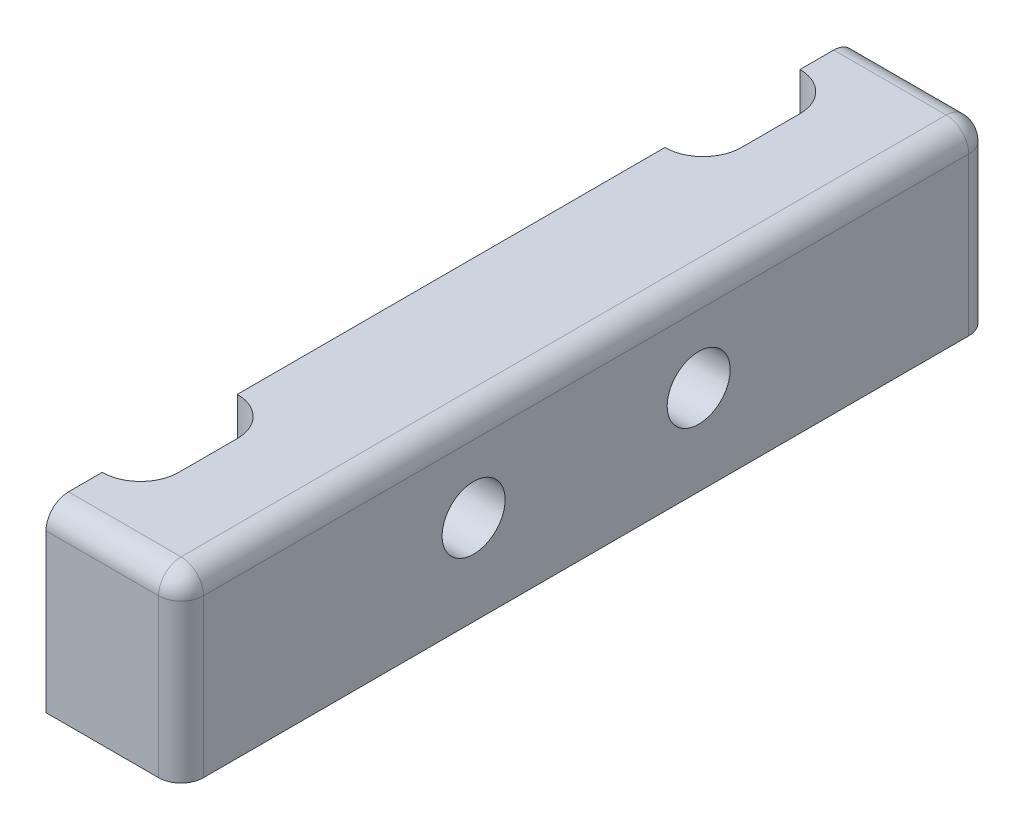
ISO-10303-21;
HEADER;
FILE_DESCRIPTION(('STEP AP214'),'2;1');
FILE_NAME('part.step','',(''),(''),'','','');
FILE_SCHEMA(('AUTOMOTIVE_DESIGN { 1 0 10303 214 1 1 1 1 }'));
ENDSEC;
DATA;
#1=APPLICATION_CONTEXT('core data for automotive mechanical design processes');
#2=APPLICATION_PROTOCOL_DEFINITION('international standard','automotive_design',2000,#1);
#3=PRODUCT_CONTEXT('',#1,'mechanical');
#4=PRODUCT('Part','Part','',(#3));
#5=PRODUCT_RELATED_PRODUCT_CATEGORY('part','',(#4));
#6=PRODUCT_DEFINITION_FORMATION('','',#4);
#7=PRODUCT_DEFINITION_CONTEXT('part definition',#1,'design');
#8=PRODUCT_DEFINITION('design','',#6,#7);
#9=PRODUCT_DEFINITION_SHAPE('','',#8);
#10=(LENGTH_UNIT() NAMED_UNIT(*) SI_UNIT(.MILLI.,.METRE.));
#11=(NAMED_UNIT(*) PLANE_ANGLE_UNIT() SI_UNIT($,.RADIAN.));
#12=(NAMED_UNIT(*) SI_UNIT($,.STERADIAN.) SOLID_ANGLE_UNIT());
#13=UNCERTAINTY_MEASURE_WITH_UNIT(LENGTH_MEASURE(1.E-05),#10,'distance_accuracy_value','');
#14=(GEOMETRIC_REPRESENTATION_CONTEXT(3) GLOBAL_UNCERTAINTY_ASSIGNED_CONTEXT((#13)) GLOBAL_UNIT_ASSIGNED_CONTEXT((#10,
#11,#12)) REPRESENTATION_CONTEXT('',''));
#15=CARTESIAN_POINT('',(0.,0.,0.));
#16=DIRECTION('',(0.,0.,1.));
#17=DIRECTION('',(1.,0.,0.));
#18=AXIS2_PLACEMENT_3D('',#15,#16,#17);
#19=CARTESIAN_POINT('',(-5.99999999999999,8.,-18.));
#20=DIRECTION('',(0.,0.,1.));
#21=DIRECTION('',(1.,0.,0.));
#22=AXIS2_PLACEMENT_3D('',#19,#20,#21);
#23=PLANE('',#22);
#24=DIRECTION('',(-1.,0.,0.));
#25=VECTOR('',#24,1.);
#26=CARTESIAN_POINT('',(-5.99999999999999,7.,-18.));
#27=LINE('',#26,#25);
#28=CARTESIAN_POINT('',(-5.99999999999999,7.,-18.));
#29=VERTEX_POINT('',#28);
#30=CARTESIAN_POINT('',(-0.999999999999995,7.,-18.));
#31=VERTEX_POINT('',#30);
#32=EDGE_CURVE('E277',#29,#31,#27,.F.);
#33=ORIENTED_EDGE('',*,*,#32,.T.);
#34=DIRECTION('',(0.,-1.,0.));
#35=VECTOR('',#34,1.);
#36=CARTESIAN_POINT('',(-0.999999999999995,8.,-18.));
#37=LINE('',#36,#35);
#38=CARTESIAN_POINT('',(-0.999999999999995,0.,-18.));
#39=VERTEX_POINT('',#38);
#40=EDGE_CURVE('E280',#31,#39,#37,.T.);
#41=ORIENTED_EDGE('',*,*,#40,.T.);
#42=DIRECTION('',(-1.,0.,0.));
#43=VECTOR('',#42,1.);
#44=CARTESIAN_POINT('',(-5.99999999999999,0.,-18.));
#45=LINE('',#44,#43);
#46=CARTESIAN_POINT('',(-5.99999999999999,0.,-18.));
#47=VERTEX_POINT('',#46);
#48=EDGE_CURVE('E209',#39,#47,#45,.T.);
#49=ORIENTED_EDGE('',*,*,#48,.T.);
#50=DIRECTION('',(0.,-1.,0.));
#51=VECTOR('',#50,1.);
#52=CARTESIAN_POINT('',(-5.99999999999999,8.,-18.));
#53=LINE('',#52,#51);
#54=EDGE_CURVE('E176',#29,#47,#53,.T.);
#55=ORIENTED_EDGE('',*,*,#54,.F.);
#56=EDGE_LOOP('',(#33,#41,#49,#55));
#57=FACE_BOUND('',#56,.T.);
#58=ADVANCED_FACE('F43',(#57),#23,.F.);
#59=CARTESIAN_POINT('',(-5.99999999999999,8.,-18.));
#60=DIRECTION('',(1.,0.,0.));
#61=DIRECTION('',(0.,0.,-1.));
#62=AXIS2_PLACEMENT_3D('',#59,#60,#61);
#63=PLANE('',#62);
#64=DIRECTION('',(0.,0.,1.));
#65=VECTOR('',#64,1.);
#66=CARTESIAN_POINT('',(-5.99999999999999,8.,-18.));
#67=LINE('',#66,#65);
#68=CARTESIAN_POINT('',(-6.,8.,-17.));
#69=VERTEX_POINT('',#68);
#70=CARTESIAN_POINT('',(-6.,8.,-15.5));
#71=VERTEX_POINT('',#70);
#72=EDGE_CURVE('E155',#69,#71,#67,.T.);
#73=ORIENTED_EDGE('',*,*,#72,.F.);
#74=CARTESIAN_POINT('',(-6.,7.,-17.));
#75=DIRECTION('',(1.,0.,0.));
#76=DIRECTION('',(0.,0.,-1.));
#77=AXIS2_PLACEMENT_3D('',#74,#75,#76);
#78=CIRCLE('',#77,1.);
#79=EDGE_CURVE('E307',#69,#29,#78,.F.);
#80=ORIENTED_EDGE('',*,*,#79,.T.);
#81=ORIENTED_EDGE('',*,*,#54,.T.);
#82=DIRECTION('',(0.,0.,1.));
#83=VECTOR('',#82,1.);
#84=CARTESIAN_POINT('',(-5.99999999999999,0.,-18.));
#85=LINE('',#84,#83);
#86=CARTESIAN_POINT('',(-6.,0.,-15.5));
#87=VERTEX_POINT('',#86);
#88=EDGE_CURVE('E172',#47,#87,#85,.T.);
#89=ORIENTED_EDGE('',*,*,#88,.T.);
#90=DIRECTION('',(0.,-1.,0.));
#91=VECTOR('',#90,1.);
#92=CARTESIAN_POINT('',(-6.,8.,-15.5));
#93=LINE('',#92,#91);
#94=EDGE_CURVE('E169',#71,#87,#93,.T.);
#95=ORIENTED_EDGE('',*,*,#94,.F.);
#96=EDGE_LOOP('',(#73,#80,#81,#89,#95));
#97=FACE_BOUND('',#96,.T.);
#98=ADVANCED_FACE('F170',(#97),#63,.F.);
#99=CARTESIAN_POINT('',(-5.99999999999999,8.,-13.8));
#100=DIRECTION('',(0.,-1.,0.));
#101=DIRECTION('',(0.,0.,-1.));
#102=AXIS2_PLACEMENT_3D('',#99,#100,#101);
#103=CYLINDRICAL_SURFACE('',#102,1.7);
#104=CARTESIAN_POINT('',(-5.99999999999999,0.,-13.8));
#105=DIRECTION('',(0.,-1.,0.));
#106=DIRECTION('',(0.,0.,1.));
#107=AXIS2_PLACEMENT_3D('',#104,#105,#106);
#108=CIRCLE('',#107,1.7);
#109=CARTESIAN_POINT('',(-4.29999999999999,0.,-13.8));
#110=VERTEX_POINT('',#109);
#111=EDGE_CURVE('E216',#87,#110,#108,.T.);
#112=ORIENTED_EDGE('',*,*,#111,.T.);
#113=DIRECTION('',(0.,-1.,0.));
#114=VECTOR('',#113,1.);
#115=CARTESIAN_POINT('',(-4.29999999999999,8.,-13.8));
#116=LINE('',#115,#114);
#117=CARTESIAN_POINT('',(-4.29999999999999,8.,-13.8));
#118=VERTEX_POINT('',#117);
#119=EDGE_CURVE('E177',#118,#110,#116,.T.);
#120=ORIENTED_EDGE('',*,*,#119,.F.);
#121=CARTESIAN_POINT('',(-5.99999999999999,8.,-13.8));
#122=DIRECTION('',(0.,-1.,0.));
#123=DIRECTION('',(0.,0.,1.));
#124=AXIS2_PLACEMENT_3D('',#121,#122,#123);
#125=CIRCLE('',#124,1.7);
#126=EDGE_CURVE('E159',#71,#118,#125,.T.);
#127=ORIENTED_EDGE('',*,*,#126,.F.);
#128=ORIENTED_EDGE('',*,*,#94,.T.);
#129=EDGE_LOOP('',(#112,#120,#127,#128));
#130=FACE_BOUND('',#129,.T.);
#131=ADVANCED_FACE('F179',(#130),#103,.F.);
#132=CARTESIAN_POINT('',(-4.29999999999999,8.,-11.2));
#133=DIRECTION('',(1.,0.,0.));
#134=DIRECTION('',(0.,0.,-1.));
#135=AXIS2_PLACEMENT_3D('',#132,#133,#134);
#136=PLANE('',#135);
#137=DIRECTION('',(0.,0.,1.));
#138=VECTOR('',#137,1.);
#139=CARTESIAN_POINT('',(-4.29999999999999,0.,-11.2));
#140=LINE('',#139,#138);
#141=CARTESIAN_POINT('',(-4.29999999999999,0.,-11.2));
#142=VERTEX_POINT('',#141);
#143=EDGE_CURVE('E219',#110,#142,#140,.T.);
#144=ORIENTED_EDGE('',*,*,#143,.T.);
#145=DIRECTION('',(0.,-1.,0.));
#146=VECTOR('',#145,1.);
#147=CARTESIAN_POINT('',(-4.29999999999999,8.,-11.2));
#148=LINE('',#147,#146);
#149=CARTESIAN_POINT('',(-4.29999999999999,8.,-11.2));
#150=VERTEX_POINT('',#149);
#151=EDGE_CURVE('E269',#150,#142,#148,.T.);
#152=ORIENTED_EDGE('',*,*,#151,.F.);
#153=DIRECTION('',(0.,0.,1.));
#154=VECTOR('',#153,1.);
#155=CARTESIAN_POINT('',(-4.29999999999999,8.,-11.2));
#156=LINE('',#155,#154);
#157=EDGE_CURVE('E183',#118,#150,#156,.T.);
#158=ORIENTED_EDGE('',*,*,#157,.F.);
#159=ORIENTED_EDGE('',*,*,#119,.T.);
#160=EDGE_LOOP('',(#144,#152,#158,#159));
#161=FACE_BOUND('',#160,.T.);
#162=ADVANCED_FACE('F403',(#161),#136,.F.);
#163=CARTESIAN_POINT('',(-5.99999999999999,8.,-11.2));
#164=DIRECTION('',(0.,-1.,0.));
#165=DIRECTION('',(0.,0.,-1.));
#166=AXIS2_PLACEMENT_3D('',#163,#164,#165);
#167=CYLINDRICAL_SURFACE('',#166,1.7);
#168=CARTESIAN_POINT('',(-5.99999999999999,0.,-11.2));
#169=DIRECTION('',(0.,-1.,0.));
#170=DIRECTION('',(0.,0.,-1.));
#171=AXIS2_PLACEMENT_3D('',#168,#169,#170);
#172=CIRCLE('',#171,1.7);
#173=CARTESIAN_POINT('',(-6.,0.,-9.5));
#174=VERTEX_POINT('',#173);
#175=EDGE_CURVE('E222',#142,#174,#172,.T.);
#176=ORIENTED_EDGE('',*,*,#175,.T.);
#177=DIRECTION('',(0.,-1.,0.));
#178=VECTOR('',#177,1.);
#179=CARTESIAN_POINT('',(-6.,8.,-9.5));
#180=LINE('',#179,#178);
#181=CARTESIAN_POINT('',(-6.,8.,-9.5));
#182=VERTEX_POINT('',#181);
#183=EDGE_CURVE('E265',#182,#174,#180,.T.);
#184=ORIENTED_EDGE('',*,*,#183,.F.);
#185=CARTESIAN_POINT('',(-5.99999999999999,8.,-11.2));
#186=DIRECTION('',(0.,-1.,0.));
#187=DIRECTION('',(0.,0.,-1.));
#188=AXIS2_PLACEMENT_3D('',#185,#186,#187);
#189=CIRCLE('',#188,1.7);
#190=EDGE_CURVE('E186',#150,#182,#189,.T.);
#191=ORIENTED_EDGE('',*,*,#190,.F.);
#192=ORIENTED_EDGE('',*,*,#151,.T.);
#193=EDGE_LOOP('',(#176,#184,#191,#192));
#194=FACE_BOUND('',#193,.T.);
#195=ADVANCED_FACE('F369',(#194),#167,.F.);
#196=CARTESIAN_POINT('',(-6.,8.,-9.5));
#197=DIRECTION('',(1.,0.,0.));
#198=DIRECTION('',(0.,0.,-1.));
#199=AXIS2_PLACEMENT_3D('',#196,#197,#198);
#200=PLANE('',#199);
#201=CARTESIAN_POINT('',(-6.,4.,-5.));
#202=DIRECTION('',(-1.,0.,0.));
#203=DIRECTION('',(0.,0.,1.));
#204=AXIS2_PLACEMENT_3D('',#201,#202,#203);
#205=CIRCLE('',#204,1.4);
#206=CARTESIAN_POINT('',(-6.,4.,-3.6));
#207=VERTEX_POINT('',#206);
#208=EDGE_CURVE('E346',#207,#207,#205,.T.);
#209=ORIENTED_EDGE('',*,*,#208,.F.);
#210=EDGE_LOOP('',(#209));
#211=FACE_BOUND('',#210,.T.);
#212=CARTESIAN_POINT('',(-6.,4.,5.00000000000001));
#213=DIRECTION('',(-1.,0.,0.));
#214=DIRECTION('',(0.,0.,-1.));
#215=AXIS2_PLACEMENT_3D('',#212,#213,#214);
#216=CIRCLE('',#215,1.4);
#217=CARTESIAN_POINT('',(-6.,4.,3.60000000000001));
#218=VERTEX_POINT('',#217);
#219=EDGE_CURVE('E341',#218,#218,#216,.T.);
#220=ORIENTED_EDGE('',*,*,#219,.F.);
#221=EDGE_LOOP('',(#220));
#222=FACE_BOUND('',#221,.T.);
#223=DIRECTION('',(0.,0.,1.));
#224=VECTOR('',#223,1.);
#225=CARTESIAN_POINT('',(-6.,0.,-9.5));
#226=LINE('',#225,#224);
#227=CARTESIAN_POINT('',(-6.,0.,9.5));
#228=VERTEX_POINT('',#227);
#229=EDGE_CURVE('E225',#174,#228,#226,.T.);
#230=ORIENTED_EDGE('',*,*,#229,.T.);
#231=DIRECTION('',(0.,-1.,0.));
#232=VECTOR('',#231,1.);
#233=CARTESIAN_POINT('',(-6.,8.,9.5));
#234=LINE('',#233,#232);
#235=CARTESIAN_POINT('',(-6.,8.,9.5));
#236=VERTEX_POINT('',#235);
#237=EDGE_CURVE('E261',#236,#228,#234,.T.);
#238=ORIENTED_EDGE('',*,*,#237,.F.);
#239=DIRECTION('',(0.,0.,1.));
#240=VECTOR('',#239,1.);
#241=CARTESIAN_POINT('',(-6.,8.,-9.5));
#242=LINE('',#241,#240);
#243=EDGE_CURVE('E192',#182,#236,#242,.T.);
#244=ORIENTED_EDGE('',*,*,#243,.F.);
#245=ORIENTED_EDGE('',*,*,#183,.T.);
#246=EDGE_LOOP('',(#230,#238,#244,#245));
#247=FACE_BOUND('',#246,.T.);
#248=ADVANCED_FACE('F365',(#211,#222,#247),#200,.F.);
#249=CARTESIAN_POINT('',(-6.,8.,11.2));
#250=DIRECTION('',(0.,-1.,0.));
#251=DIRECTION('',(0.,0.,-1.));
#252=AXIS2_PLACEMENT_3D('',#249,#250,#251);
#253=CYLINDRICAL_SURFACE('',#252,1.7);
#254=CARTESIAN_POINT('',(-6.,0.,11.2));
#255=DIRECTION('',(0.,-1.,0.));
#256=DIRECTION('',(0.,0.,1.));
#257=AXIS2_PLACEMENT_3D('',#254,#255,#256);
#258=CIRCLE('',#257,1.7);
#259=CARTESIAN_POINT('',(-4.29999999999999,0.,11.2));
#260=VERTEX_POINT('',#259);
#261=EDGE_CURVE('E228',#228,#260,#258,.T.);
#262=ORIENTED_EDGE('',*,*,#261,.T.);
#263=DIRECTION('',(0.,-1.,0.));
#264=VECTOR('',#263,1.);
#265=CARTESIAN_POINT('',(-4.29999999999999,8.,11.2));
#266=LINE('',#265,#264);
#267=CARTESIAN_POINT('',(-4.29999999999999,8.,11.2));
#268=VERTEX_POINT('',#267);
#269=EDGE_CURVE('E257',#268,#260,#266,.T.);
#270=ORIENTED_EDGE('',*,*,#269,.F.);
#271=CARTESIAN_POINT('',(-6.,8.,11.2));
#272=DIRECTION('',(0.,-1.,0.));
#273=DIRECTION('',(0.,0.,1.));
#274=AXIS2_PLACEMENT_3D('',#271,#272,#273);
#275=CIRCLE('',#274,1.7);
#276=EDGE_CURVE('E195',#236,#268,#275,.T.);
#277=ORIENTED_EDGE('',*,*,#276,.F.);
#278=ORIENTED_EDGE('',*,*,#237,.T.);
#279=EDGE_LOOP('',(#262,#270,#277,#278));
#280=FACE_BOUND('',#279,.T.);
#281=ADVANCED_FACE('F368',(#280),#253,.F.);
#282=CARTESIAN_POINT('',(-4.29999999999999,8.,13.8));
#283=DIRECTION('',(1.,0.,0.));
#284=DIRECTION('',(0.,0.,-1.));
#285=AXIS2_PLACEMENT_3D('',#282,#283,#284);
#286=PLANE('',#285);
#287=DIRECTION('',(0.,0.,1.));
#288=VECTOR('',#287,1.);
#289=CARTESIAN_POINT('',(-4.29999999999999,0.,13.8));
#290=LINE('',#289,#288);
#291=CARTESIAN_POINT('',(-4.29999999999999,0.,13.8));
#292=VERTEX_POINT('',#291);
#293=EDGE_CURVE('E231',#260,#292,#290,.T.);
#294=ORIENTED_EDGE('',*,*,#293,.T.);
#295=DIRECTION('',(0.,-1.,0.));
#296=VECTOR('',#295,1.);
#297=CARTESIAN_POINT('',(-4.29999999999999,8.,13.8));
#298=LINE('',#297,#296);
#299=CARTESIAN_POINT('',(-4.29999999999999,8.,13.8));
#300=VERTEX_POINT('',#299);
#301=EDGE_CURVE('E253',#300,#292,#298,.T.);
#302=ORIENTED_EDGE('',*,*,#301,.F.);
#303=DIRECTION('',(0.,0.,1.));
#304=VECTOR('',#303,1.);
#305=CARTESIAN_POINT('',(-4.29999999999999,8.,13.8));
#306=LINE('',#305,#304);
#307=EDGE_CURVE('E198',#268,#300,#306,.T.);
#308=ORIENTED_EDGE('',*,*,#307,.F.);
#309=ORIENTED_EDGE('',*,*,#269,.T.);
#310=EDGE_LOOP('',(#294,#302,#308,#309));
#311=FACE_BOUND('',#310,.T.);
#312=ADVANCED_FACE('F390',(#311),#286,.F.);
#313=CARTESIAN_POINT('',(-5.99999999999999,8.,13.8));
#314=DIRECTION('',(0.,-1.,0.));
#315=DIRECTION('',(0.,0.,-1.));
#316=AXIS2_PLACEMENT_3D('',#313,#314,#315);
#317=CYLINDRICAL_SURFACE('',#316,1.7);
#318=CARTESIAN_POINT('',(-5.99999999999999,0.,13.8));
#319=DIRECTION('',(0.,-1.,0.));
#320=DIRECTION('',(0.,0.,-1.));
#321=AXIS2_PLACEMENT_3D('',#318,#319,#320);
#322=CIRCLE('',#321,1.7);
#323=CARTESIAN_POINT('',(-5.99999999999999,0.,15.5));
#324=VERTEX_POINT('',#323);
#325=EDGE_CURVE('E234',#292,#324,#322,.T.);
#326=ORIENTED_EDGE('',*,*,#325,.T.);
#327=DIRECTION('',(0.,-1.,0.));
#328=VECTOR('',#327,1.);
#329=CARTESIAN_POINT('',(-5.99999999999999,8.,15.5));
#330=LINE('',#329,#328);
#331=CARTESIAN_POINT('',(-5.99999999999999,8.,15.5));
#332=VERTEX_POINT('',#331);
#333=EDGE_CURVE('E249',#332,#324,#330,.T.);
#334=ORIENTED_EDGE('',*,*,#333,.F.);
#335=CARTESIAN_POINT('',(-5.99999999999999,8.,13.8));
#336=DIRECTION('',(0.,-1.,0.));
#337=DIRECTION('',(0.,0.,-1.));
#338=AXIS2_PLACEMENT_3D('',#335,#336,#337);
#339=CIRCLE('',#338,1.7);
#340=EDGE_CURVE('E201',#300,#332,#339,.T.);
#341=ORIENTED_EDGE('',*,*,#340,.F.);
#342=ORIENTED_EDGE('',*,*,#301,.T.);
#343=EDGE_LOOP('',(#326,#334,#341,#342));
#344=FACE_BOUND('',#343,.T.);
#345=ADVANCED_FACE('F394',(#344),#317,.F.);
#346=CARTESIAN_POINT('',(-5.99999999999999,8.,18.));
#347=DIRECTION('',(1.,0.,0.));
#348=DIRECTION('',(0.,0.,-1.));
#349=AXIS2_PLACEMENT_3D('',#346,#347,#348);
#350=PLANE('',#349);
#351=DIRECTION('',(0.,-1.,0.));
#352=VECTOR('',#351,1.);
#353=CARTESIAN_POINT('',(-5.99999999999999,8.,18.));
#354=LINE('',#353,#352);
#355=CARTESIAN_POINT('',(-5.99999999999999,7.,18.));
#356=VERTEX_POINT('',#355);
#357=CARTESIAN_POINT('',(-5.99999999999999,0.,18.));
#358=VERTEX_POINT('',#357);
#359=EDGE_CURVE('E208',#356,#358,#354,.T.);
#360=ORIENTED_EDGE('',*,*,#359,.F.);
#361=CARTESIAN_POINT('',(-5.99999999999999,7.,17.));
#362=DIRECTION('',(1.,0.,0.));
#363=DIRECTION('',(0.,0.,-1.));
#364=AXIS2_PLACEMENT_3D('',#361,#362,#363);
#365=CIRCLE('',#364,1.);
#366=CARTESIAN_POINT('',(-5.99999999999999,8.,17.));
#367=VERTEX_POINT('',#366);
#368=EDGE_CURVE('E11',#356,#367,#365,.F.);
#369=ORIENTED_EDGE('',*,*,#368,.T.);
#370=DIRECTION('',(0.,0.,1.));
#371=VECTOR('',#370,1.);
#372=CARTESIAN_POINT('',(-5.99999999999999,8.,18.));
#373=LINE('',#372,#371);
#374=EDGE_CURVE('E204',#332,#367,#373,.T.);
#375=ORIENTED_EDGE('',*,*,#374,.F.);
#376=ORIENTED_EDGE('',*,*,#333,.T.);
#377=DIRECTION('',(0.,0.,1.));
#378=VECTOR('',#377,1.);
#379=CARTESIAN_POINT('',(-5.99999999999999,0.,18.));
#380=LINE('',#379,#378);
#381=EDGE_CURVE('E237',#324,#358,#380,.T.);
#382=ORIENTED_EDGE('',*,*,#381,.T.);
#383=EDGE_LOOP('',(#360,#369,#375,#376,#382));
#384=FACE_BOUND('',#383,.T.);
#385=ADVANCED_FACE('F447',(#384),#350,.F.);
#386=CARTESIAN_POINT('',(-5.99999999999999,8.,18.));
#387=DIRECTION('',(0.,0.,-1.));
#388=DIRECTION('',(-1.,0.,0.));
#389=AXIS2_PLACEMENT_3D('',#386,#387,#388);
#390=PLANE('',#389);
#391=DIRECTION('',(1.,0.,0.));
#392=VECTOR('',#391,1.);
#393=CARTESIAN_POINT('',(-5.99999999999999,0.,18.));
#394=LINE('',#393,#392);
#395=CARTESIAN_POINT('',(-0.999999999999995,0.,18.));
#396=VERTEX_POINT('',#395);
#397=EDGE_CURVE('E241',#358,#396,#394,.T.);
#398=ORIENTED_EDGE('',*,*,#397,.T.);
#399=DIRECTION('',(0.,-1.,0.));
#400=VECTOR('',#399,1.);
#401=CARTESIAN_POINT('',(-0.999999999999995,8.,18.));
#402=LINE('',#401,#400);
#403=CARTESIAN_POINT('',(-0.999999999999995,7.,18.));
#404=VERTEX_POINT('',#403);
#405=EDGE_CURVE('E53',#396,#404,#402,.F.);
#406=ORIENTED_EDGE('',*,*,#405,.T.);
#407=DIRECTION('',(1.,0.,0.));
#408=VECTOR('',#407,1.);
#409=CARTESIAN_POINT('',(-5.99999999999999,7.,18.));
#410=LINE('',#409,#408);
#411=EDGE_CURVE('E64',#404,#356,#410,.F.);
#412=ORIENTED_EDGE('',*,*,#411,.T.);
#413=ORIENTED_EDGE('',*,*,#359,.T.);
#414=EDGE_LOOP('',(#398,#406,#412,#413));
#415=FACE_BOUND('',#414,.T.);
#416=ADVANCED_FACE('F449',(#415),#390,.F.);
#417=CARTESIAN_POINT('',(0.,8.,-18.));
#418=DIRECTION('',(-1.,0.,0.));
#419=DIRECTION('',(0.,0.,1.));
#420=AXIS2_PLACEMENT_3D('',#417,#418,#419);
#421=PLANE('',#420);
#422=CARTESIAN_POINT('',(0.,4.,-5.));
#423=DIRECTION('',(-1.,0.,0.));
#424=DIRECTION('',(0.,0.,1.));
#425=AXIS2_PLACEMENT_3D('',#422,#423,#424);
#426=CIRCLE('',#425,1.4);
#427=CARTESIAN_POINT('',(0.,4.,-3.6));
#428=VERTEX_POINT('',#427);
#429=EDGE_CURVE('E213',#428,#428,#426,.T.);
#430=ORIENTED_EDGE('',*,*,#429,.T.);
#431=EDGE_LOOP('',(#430));
#432=FACE_BOUND('',#431,.T.);
#433=CARTESIAN_POINT('',(0.,4.,5.));
#434=DIRECTION('',(-1.,0.,0.));
#435=DIRECTION('',(0.,0.,-1.));
#436=AXIS2_PLACEMENT_3D('',#433,#434,#435);
#437=CIRCLE('',#436,1.4);
#438=CARTESIAN_POINT('',(0.,4.,3.6));
#439=VERTEX_POINT('',#438);
#440=EDGE_CURVE('E337',#439,#439,#437,.T.);
#441=ORIENTED_EDGE('',*,*,#440,.T.);
#442=EDGE_LOOP('',(#441));
#443=FACE_BOUND('',#442,.T.);
#444=DIRECTION('',(0.,0.,-1.));
#445=VECTOR('',#444,1.);
#446=CARTESIAN_POINT('',(0.,0.,-18.));
#447=LINE('',#446,#445);
#448=CARTESIAN_POINT('',(0.,0.,17.));
#449=VERTEX_POINT('',#448);
#450=CARTESIAN_POINT('',(0.,0.,-17.));
#451=VERTEX_POINT('',#450);
#452=EDGE_CURVE('E166',#449,#451,#447,.T.);
#453=ORIENTED_EDGE('',*,*,#452,.T.);
#454=DIRECTION('',(0.,-1.,0.));
#455=VECTOR('',#454,1.);
#456=CARTESIAN_POINT('',(0.,8.,-17.));
#457=LINE('',#456,#455);
#458=CARTESIAN_POINT('',(0.,7.,-17.));
#459=VERTEX_POINT('',#458);
#460=EDGE_CURVE('E296',#451,#459,#457,.F.);
#461=ORIENTED_EDGE('',*,*,#460,.T.);
#462=DIRECTION('',(0.,0.,-1.));
#463=VECTOR('',#462,1.);
#464=CARTESIAN_POINT('',(0.,7.,-18.));
#465=LINE('',#464,#463);
#466=CARTESIAN_POINT('',(0.,7.,17.));
#467=VERTEX_POINT('',#466);
#468=EDGE_CURVE('E293',#459,#467,#465,.F.);
#469=ORIENTED_EDGE('',*,*,#468,.T.);
#470=DIRECTION('',(0.,-1.,0.));
#471=VECTOR('',#470,1.);
#472=CARTESIAN_POINT('',(0.,8.,17.));
#473=LINE('',#472,#471);
#474=EDGE_CURVE('E290',#467,#449,#473,.T.);
#475=ORIENTED_EDGE('',*,*,#474,.T.);
#476=EDGE_LOOP('',(#453,#461,#469,#475));
#477=FACE_BOUND('',#476,.T.);
#478=ADVANCED_FACE('F356',(#432,#443,#477),#421,.F.);
#479=CARTESIAN_POINT('',(-5.99999999999999,8.,13.8));
#480=DIRECTION('',(0.,-1.,0.));
#481=DIRECTION('',(0.,0.,-1.));
#482=AXIS2_PLACEMENT_3D('',#479,#480,#481);
#483=PLANE('',#482);
#484=DIRECTION('',(0.,0.,-1.));
#485=VECTOR('',#484,1.);
#486=CARTESIAN_POINT('',(-0.999999999999995,8.,13.8));
#487=LINE('',#486,#485);
#488=CARTESIAN_POINT('',(-0.999999999999995,8.,17.));
#489=VERTEX_POINT('',#488);
#490=CARTESIAN_POINT('',(-0.999999999999995,8.,-17.));
#491=VERTEX_POINT('',#490);
#492=EDGE_CURVE('E302',#489,#491,#487,.T.);
#493=ORIENTED_EDGE('',*,*,#492,.T.);
#494=DIRECTION('',(-1.,0.,0.));
#495=VECTOR('',#494,1.);
#496=CARTESIAN_POINT('',(-5.99999999999999,8.,-17.));
#497=LINE('',#496,#495);
#498=EDGE_CURVE('E162',#491,#69,#497,.T.);
#499=ORIENTED_EDGE('',*,*,#498,.T.);
#500=ORIENTED_EDGE('',*,*,#72,.T.);
#501=ORIENTED_EDGE('',*,*,#126,.T.);
#502=ORIENTED_EDGE('',*,*,#157,.T.);
#503=ORIENTED_EDGE('',*,*,#190,.T.);
#504=ORIENTED_EDGE('',*,*,#243,.T.);
#505=ORIENTED_EDGE('',*,*,#276,.T.);
#506=ORIENTED_EDGE('',*,*,#307,.T.);
#507=ORIENTED_EDGE('',*,*,#340,.T.);
#508=ORIENTED_EDGE('',*,*,#374,.T.);
#509=DIRECTION('',(1.,0.,0.));
#510=VECTOR('',#509,1.);
#511=CARTESIAN_POINT('',(-5.99999999999999,8.,17.));
#512=LINE('',#511,#510);
#513=EDGE_CURVE('E299',#367,#489,#512,.T.);
#514=ORIENTED_EDGE('',*,*,#513,.T.);
#515=EDGE_LOOP('',(#493,#499,#500,#501,#502,#503,#504,#505,#506,#507,#508,#514));
#516=FACE_BOUND('',#515,.T.);
#517=ADVANCED_FACE('F157',(#516),#483,.F.);
#518=CARTESIAN_POINT('',(-5.99999999999999,0.,13.8));
#519=DIRECTION('',(0.,-1.,0.));
#520=DIRECTION('',(0.,0.,-1.));
#521=AXIS2_PLACEMENT_3D('',#518,#519,#520);
#522=PLANE('',#521);
#523=ORIENTED_EDGE('',*,*,#48,.F.);
#524=CARTESIAN_POINT('',(-0.999999999999995,0.,-17.));
#525=DIRECTION('',(0.,-1.,0.));
#526=DIRECTION('',(0.,0.,-1.));
#527=AXIS2_PLACEMENT_3D('',#524,#525,#526);
#528=CIRCLE('',#527,1.);
#529=EDGE_CURVE('E287',#39,#451,#528,.T.);
#530=ORIENTED_EDGE('',*,*,#529,.T.);
#531=ORIENTED_EDGE('',*,*,#452,.F.);
#532=CARTESIAN_POINT('',(-0.999999999999995,0.,17.));
#533=DIRECTION('',(0.,-1.,0.));
#534=DIRECTION('',(0.,0.,-1.));
#535=AXIS2_PLACEMENT_3D('',#532,#533,#534);
#536=CIRCLE('',#535,1.);
#537=EDGE_CURVE('E284',#449,#396,#536,.T.);
#538=ORIENTED_EDGE('',*,*,#537,.T.);
#539=ORIENTED_EDGE('',*,*,#397,.F.);
#540=ORIENTED_EDGE('',*,*,#381,.F.);
#541=ORIENTED_EDGE('',*,*,#325,.F.);
#542=ORIENTED_EDGE('',*,*,#293,.F.);
#543=ORIENTED_EDGE('',*,*,#261,.F.);
#544=ORIENTED_EDGE('',*,*,#229,.F.);
#545=ORIENTED_EDGE('',*,*,#175,.F.);
#546=ORIENTED_EDGE('',*,*,#143,.F.);
#547=ORIENTED_EDGE('',*,*,#111,.F.);
#548=ORIENTED_EDGE('',*,*,#88,.F.);
#549=EDGE_LOOP('',(#523,#530,#531,#538,#539,#540,#541,#542,#543,#544,#545,#546,#547,#548));
#550=FACE_BOUND('',#549,.T.);
#551=ADVANCED_FACE('F385',(#550),#522,.T.);
#552=CARTESIAN_POINT('',(0.,4.,5.));
#553=DIRECTION('',(-1.,0.,0.));
#554=DIRECTION('',(0.,0.,1.));
#555=AXIS2_PLACEMENT_3D('',#552,#553,#554);
#556=CYLINDRICAL_SURFACE('',#555,1.4);
#557=ORIENTED_EDGE('',*,*,#440,.F.);
#558=EDGE_LOOP('',(#557));
#559=FACE_BOUND('',#558,.T.);
#560=ORIENTED_EDGE('',*,*,#219,.T.);
#561=EDGE_LOOP('',(#560));
#562=FACE_BOUND('',#561,.T.);
#563=ADVANCED_FACE('F361',(#559,#562),#556,.F.);
#564=CARTESIAN_POINT('',(0.,4.,-5.));
#565=DIRECTION('',(-1.,0.,0.));
#566=DIRECTION('',(0.,0.,1.));
#567=AXIS2_PLACEMENT_3D('',#564,#565,#566);
#568=CYLINDRICAL_SURFACE('',#567,1.4);
#569=ORIENTED_EDGE('',*,*,#429,.F.);
#570=EDGE_LOOP('',(#569));
#571=FACE_BOUND('',#570,.T.);
#572=ORIENTED_EDGE('',*,*,#208,.T.);
#573=EDGE_LOOP('',(#572));
#574=FACE_BOUND('',#573,.T.);
#575=ADVANCED_FACE('F358',(#571,#574),#568,.F.);
#576=CARTESIAN_POINT('',(-0.999999999999995,8.,17.));
#577=DIRECTION('',(0.,-1.,0.));
#578=DIRECTION('',(0.,0.,-1.));
#579=AXIS2_PLACEMENT_3D('',#576,#577,#578);
#580=CYLINDRICAL_SURFACE('',#579,1.);
#581=ORIENTED_EDGE('',*,*,#537,.F.);
#582=ORIENTED_EDGE('',*,*,#474,.F.);
#583=CARTESIAN_POINT('',(-0.999999999999995,7.,17.));
#584=DIRECTION('',(0.,1.,0.));
#585=DIRECTION('',(0.,0.,1.));
#586=AXIS2_PLACEMENT_3D('',#583,#584,#585);
#587=CIRCLE('',#586,1.);
#588=EDGE_CURVE('E47',#404,#467,#587,.T.);
#589=ORIENTED_EDGE('',*,*,#588,.F.);
#590=ORIENTED_EDGE('',*,*,#405,.F.);
#591=EDGE_LOOP('',(#581,#582,#589,#590));
#592=FACE_BOUND('',#591,.T.);
#593=ADVANCED_FACE('F45',(#592),#580,.T.);
#594=CARTESIAN_POINT('',(-5.99999999999999,7.,17.));
#595=DIRECTION('',(1.,0.,0.));
#596=DIRECTION('',(0.,0.,-1.));
#597=AXIS2_PLACEMENT_3D('',#594,#595,#596);
#598=CYLINDRICAL_SURFACE('',#597,1.);
#599=ORIENTED_EDGE('',*,*,#368,.F.);
#600=ORIENTED_EDGE('',*,*,#411,.F.);
#601=CARTESIAN_POINT('',(-0.999999999999995,7.,17.));
#602=DIRECTION('',(1.,0.,0.));
#603=DIRECTION('',(0.,0.,-1.));
#604=AXIS2_PLACEMENT_3D('',#601,#602,#603);
#605=CIRCLE('',#604,1.);
#606=EDGE_CURVE('E329',#489,#404,#605,.T.);
#607=ORIENTED_EDGE('',*,*,#606,.F.);
#608=ORIENTED_EDGE('',*,*,#513,.F.);
#609=EDGE_LOOP('',(#599,#600,#607,#608));
#610=FACE_BOUND('',#609,.T.);
#611=ADVANCED_FACE('F438',(#610),#598,.T.);
#612=CARTESIAN_POINT('',(-0.999999999999995,7.,17.));
#613=DIRECTION('',(0.,0.,1.));
#614=DIRECTION('',(1.,0.,0.));
#615=AXIS2_PLACEMENT_3D('',#612,#613,#614);
#616=SPHERICAL_SURFACE('',#615,1.);
#617=ORIENTED_EDGE('',*,*,#606,.T.);
#618=ORIENTED_EDGE('',*,*,#588,.T.);
#619=CARTESIAN_POINT('',(-0.999999999999995,7.,17.));
#620=DIRECTION('',(0.,0.,1.));
#621=DIRECTION('',(1.,0.,0.));
#622=AXIS2_PLACEMENT_3D('',#619,#620,#621);
#623=CIRCLE('',#622,1.);
#624=EDGE_CURVE('E326',#489,#467,#623,.F.);
#625=ORIENTED_EDGE('',*,*,#624,.F.);
#626=EDGE_LOOP('',(#617,#618,#625));
#627=FACE_BOUND('',#626,.T.);
#628=ADVANCED_FACE('F435',(#627),#616,.T.);
#629=CARTESIAN_POINT('',(-0.999999999999995,7.,13.8));
#630=DIRECTION('',(0.,0.,-1.));
#631=DIRECTION('',(-1.,0.,0.));
#632=AXIS2_PLACEMENT_3D('',#629,#630,#631);
#633=CYLINDRICAL_SURFACE('',#632,1.);
#634=ORIENTED_EDGE('',*,*,#624,.T.);
#635=ORIENTED_EDGE('',*,*,#468,.F.);
#636=CARTESIAN_POINT('',(-0.999999999999995,7.,-17.));
#637=DIRECTION('',(0.,0.,-1.));
#638=DIRECTION('',(-1.,0.,0.));
#639=AXIS2_PLACEMENT_3D('',#636,#637,#638);
#640=CIRCLE('',#639,1.);
#641=EDGE_CURVE('E322',#491,#459,#640,.T.);
#642=ORIENTED_EDGE('',*,*,#641,.F.);
#643=ORIENTED_EDGE('',*,*,#492,.F.);
#644=EDGE_LOOP('',(#634,#635,#642,#643));
#645=FACE_BOUND('',#644,.T.);
#646=ADVANCED_FACE('F431',(#645),#633,.T.);
#647=CARTESIAN_POINT('',(-5.99999999999999,7.,-17.));
#648=DIRECTION('',(-1.,0.,0.));
#649=DIRECTION('',(0.,0.,1.));
#650=AXIS2_PLACEMENT_3D('',#647,#648,#649);
#651=CYLINDRICAL_SURFACE('',#650,1.);
#652=ORIENTED_EDGE('',*,*,#79,.F.);
#653=ORIENTED_EDGE('',*,*,#498,.F.);
#654=CARTESIAN_POINT('',(-0.999999999999995,7.,-17.));
#655=DIRECTION('',(1.,0.,0.));
#656=DIRECTION('',(0.,0.,-1.));
#657=AXIS2_PLACEMENT_3D('',#654,#655,#656);
#658=CIRCLE('',#657,1.);
#659=EDGE_CURVE('E318',#31,#491,#658,.T.);
#660=ORIENTED_EDGE('',*,*,#659,.F.);
#661=ORIENTED_EDGE('',*,*,#32,.F.);
#662=EDGE_LOOP('',(#652,#653,#660,#661));
#663=FACE_BOUND('',#662,.T.);
#664=ADVANCED_FACE('F427',(#663),#651,.T.);
#665=CARTESIAN_POINT('',(-0.999999999999995,7.,-17.));
#666=DIRECTION('',(0.,1.,0.));
#667=DIRECTION('',(0.,0.,1.));
#668=AXIS2_PLACEMENT_3D('',#665,#666,#667);
#669=SPHERICAL_SURFACE('',#668,1.);
#670=ORIENTED_EDGE('',*,*,#659,.T.);
#671=ORIENTED_EDGE('',*,*,#641,.T.);
#672=CARTESIAN_POINT('',(-0.999999999999995,7.,-17.));
#673=DIRECTION('',(0.,1.,0.));
#674=DIRECTION('',(0.,0.,1.));
#675=AXIS2_PLACEMENT_3D('',#672,#673,#674);
#676=CIRCLE('',#675,1.);
#677=EDGE_CURVE('E314',#31,#459,#676,.F.);
#678=ORIENTED_EDGE('',*,*,#677,.F.);
#679=EDGE_LOOP('',(#670,#671,#678));
#680=FACE_BOUND('',#679,.T.);
#681=ADVANCED_FACE('F423',(#680),#669,.T.);
#682=CARTESIAN_POINT('',(-0.999999999999995,8.,-17.));
#683=DIRECTION('',(0.,-1.,0.));
#684=DIRECTION('',(0.,0.,-1.));
#685=AXIS2_PLACEMENT_3D('',#682,#683,#684);
#686=CYLINDRICAL_SURFACE('',#685,1.);
#687=ORIENTED_EDGE('',*,*,#677,.T.);
#688=ORIENTED_EDGE('',*,*,#460,.F.);
#689=ORIENTED_EDGE('',*,*,#529,.F.);
#690=ORIENTED_EDGE('',*,*,#40,.F.);
#691=EDGE_LOOP('',(#687,#688,#689,#690));
#692=FACE_BOUND('',#691,.T.);
#693=ADVANCED_FACE('F420',(#692),#686,.T.);
#694=CLOSED_SHELL('',(#58,#98,#131,#162,#195,#248,#281,#312,#345,#385,#416,#478,#517,#551,#563,
#575,#593,#611,#628,#646,#664,#681,#693));
#695=MANIFOLD_SOLID_BREP('B2',#694);
#696=ADVANCED_BREP_SHAPE_REPRESENTATION('',(#18,#695),#14);
#697=SHAPE_DEFINITION_REPRESENTATION(#9,#696);
ENDSEC;
END-ISO-10303-21;
